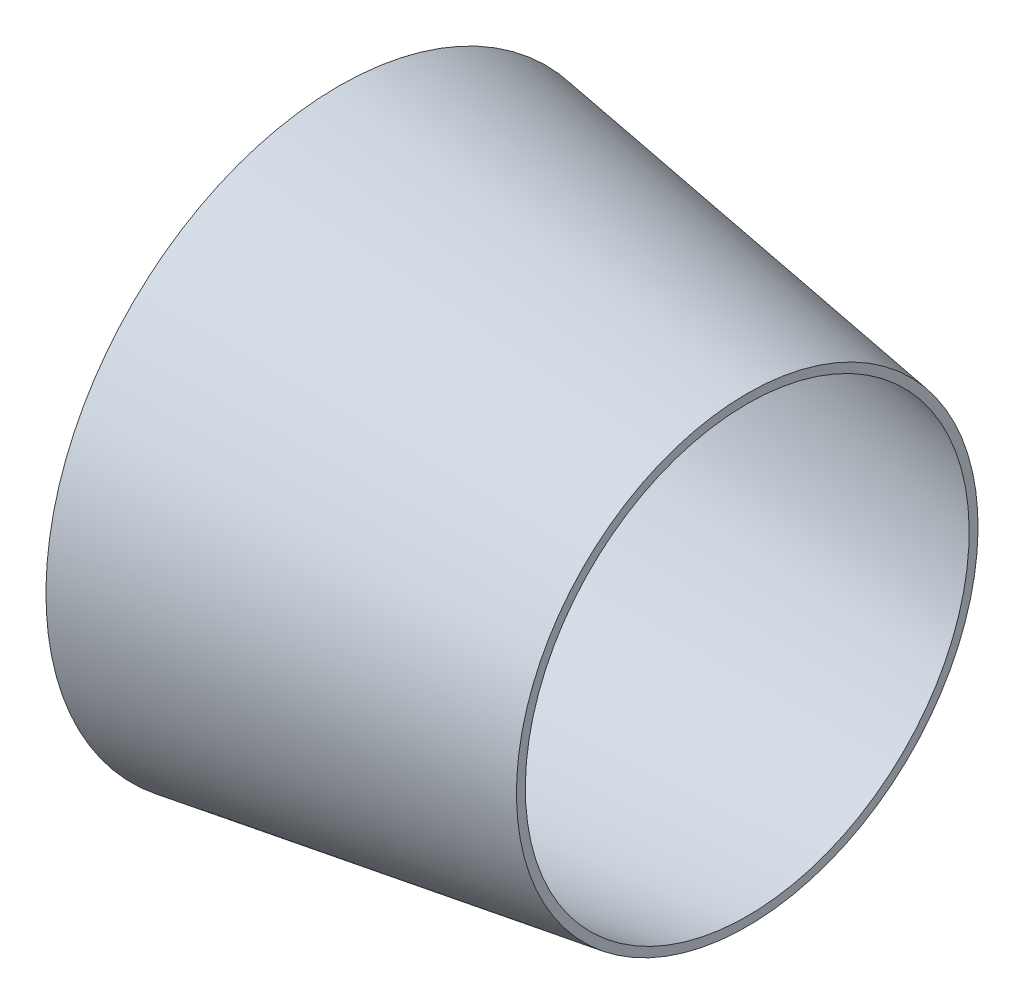
ISO-10303-21;
HEADER;
FILE_DESCRIPTION(('STEP AP214'),'2;1');
FILE_NAME('part.step','',(''),(''),'','','');
FILE_SCHEMA(('AUTOMOTIVE_DESIGN { 1 0 10303 214 1 1 1 1 }'));
ENDSEC;
DATA;
#1=APPLICATION_CONTEXT('core data for automotive mechanical design processes');
#2=APPLICATION_PROTOCOL_DEFINITION('international standard','automotive_design',2000,#1);
#3=PRODUCT_CONTEXT('',#1,'mechanical');
#4=PRODUCT('Part','Part','',(#3));
#5=PRODUCT_RELATED_PRODUCT_CATEGORY('part','',(#4));
#6=PRODUCT_DEFINITION_FORMATION('','',#4);
#7=PRODUCT_DEFINITION_CONTEXT('part definition',#1,'design');
#8=PRODUCT_DEFINITION('design','',#6,#7);
#9=PRODUCT_DEFINITION_SHAPE('','',#8);
#10=(LENGTH_UNIT() NAMED_UNIT(*) SI_UNIT(.MILLI.,.METRE.));
#11=(NAMED_UNIT(*) PLANE_ANGLE_UNIT() SI_UNIT($,.RADIAN.));
#12=(NAMED_UNIT(*) SI_UNIT($,.STERADIAN.) SOLID_ANGLE_UNIT());
#13=UNCERTAINTY_MEASURE_WITH_UNIT(LENGTH_MEASURE(1.E-05),#10,'distance_accuracy_value','');
#14=(GEOMETRIC_REPRESENTATION_CONTEXT(3) GLOBAL_UNCERTAINTY_ASSIGNED_CONTEXT((#13)) GLOBAL_UNIT_ASSIGNED_CONTEXT((#10,
#11,#12)) REPRESENTATION_CONTEXT('',''));
#15=CARTESIAN_POINT('',(0.,0.,0.));
#16=DIRECTION('',(0.,0.,1.));
#17=DIRECTION('',(1.,0.,0.));
#18=AXIS2_PLACEMENT_3D('',#15,#16,#17);
#19=CARTESIAN_POINT('',(3200.,0.,0.));
#20=DIRECTION('',(-1.,0.,0.));
#21=DIRECTION('',(0.,0.,1.));
#22=AXIS2_PLACEMENT_3D('',#19,#20,#21);
#23=CONICAL_SURFACE('',#22,1550.,0.129702537155912);
#24=CARTESIAN_POINT('',(3200.,0.,0.));
#25=DIRECTION('',(-1.,0.,0.));
#26=DIRECTION('',(0.,0.,1.));
#27=AXIS2_PLACEMENT_3D('',#24,#25,#26);
#28=CIRCLE('',#27,1550.);
#29=CARTESIAN_POINT('',(3200.,1550.,-1.1128358392509E-05));
#30=VERTEX_POINT('',#29);
#31=CARTESIAN_POINT('',(3200.,1550.,0.));
#32=VERTEX_POINT('',#31);
#33=EDGE_CURVE('E11',#30,#32,#28,.T.);
#34=ORIENTED_EDGE('',*,*,#33,.T.);
#35=DIRECTION('',(0.991600411186222,-0.129339184067768,0.));
#36=VECTOR('',#35,1.);
#37=CARTESIAN_POINT('',(5500.,1250.,0.));
#38=LINE('',#37,#36);
#39=CARTESIAN_POINT('',(5500.,1250.,0.));
#40=VERTEX_POINT('',#39);
#41=EDGE_CURVE('E100',#32,#40,#38,.T.);
#42=ORIENTED_EDGE('',*,*,#41,.T.);
#43=CARTESIAN_POINT('',(5500.,0.,0.));
#44=DIRECTION('',(-1.,0.,0.));
#45=DIRECTION('',(0.,0.,1.));
#46=AXIS2_PLACEMENT_3D('',#43,#44,#45);
#47=CIRCLE('',#46,1250.);
#48=CARTESIAN_POINT('',(5500.,1250.,-8.97448257460403E-06));
#49=VERTEX_POINT('',#48);
#50=EDGE_CURVE('E80',#49,#40,#47,.T.);
#51=ORIENTED_EDGE('',*,*,#50,.F.);
#52=DIRECTION('',(0.991600411186222,-0.129339184067768,9.2860180290375E-10));
#53=VECTOR('',#52,1.);
#54=CARTESIAN_POINT('',(5500.,1250.,-8.97448257460403E-06));
#55=LINE('',#54,#53);
#56=EDGE_CURVE('E103',#30,#49,#55,.T.);
#57=ORIENTED_EDGE('',*,*,#56,.F.);
#58=EDGE_LOOP('',(#34,#42,#51,#57));
#59=FACE_BOUND('',#58,.T.);
#60=ADVANCED_FACE('F39',(#59),#23,.F.);
#61=CARTESIAN_POINT('',(3200.,1550.,-1.1128358392509E-05));
#62=DIRECTION('',(1.,0.,0.));
#63=DIRECTION('',(0.,0.,-1.));
#64=AXIS2_PLACEMENT_3D('',#61,#62,#63);
#65=PLANE('',#64);
#66=CARTESIAN_POINT('',(3200.,0.,0.));
#67=DIRECTION('',(-1.,0.,0.));
#68=DIRECTION('',(0.,0.,1.));
#69=AXIS2_PLACEMENT_3D('',#66,#67,#68);
#70=CIRCLE('',#69,1650.);
#71=CARTESIAN_POINT('',(3200.,1650.,-1.18463169984773E-05));
#72=VERTEX_POINT('',#71);
#73=CARTESIAN_POINT('',(3200.,1650.,0.));
#74=VERTEX_POINT('',#73);
#75=EDGE_CURVE('E50',#72,#74,#70,.T.);
#76=ORIENTED_EDGE('',*,*,#75,.T.);
#77=DIRECTION('',(0.,-1.,0.));
#78=VECTOR('',#77,1.);
#79=CARTESIAN_POINT('',(3200.,1550.,0.));
#80=LINE('',#79,#78);
#81=EDGE_CURVE('E104',#74,#32,#80,.T.);
#82=ORIENTED_EDGE('',*,*,#81,.T.);
#83=ORIENTED_EDGE('',*,*,#33,.F.);
#84=DIRECTION('',(0.,-1.,7.17958605968322E-09));
#85=VECTOR('',#84,1.);
#86=CARTESIAN_POINT('',(3200.,1550.,-1.1128358392509E-05));
#87=LINE('',#86,#85);
#88=EDGE_CURVE('E91',#72,#30,#87,.T.);
#89=ORIENTED_EDGE('',*,*,#88,.F.);
#90=EDGE_LOOP('',(#76,#82,#83,#89));
#91=FACE_BOUND('',#90,.T.);
#92=ADVANCED_FACE('F41',(#91),#65,.F.);
#93=CARTESIAN_POINT('',(5500.,0.,0.));
#94=DIRECTION('',(-1.,0.,0.));
#95=DIRECTION('',(0.,0.,1.));
#96=AXIS2_PLACEMENT_3D('',#93,#94,#95);
#97=CONICAL_SURFACE('',#96,1300.,0.151015342921359);
#98=CARTESIAN_POINT('',(5500.,0.,0.));
#99=DIRECTION('',(-1.,0.,0.));
#100=DIRECTION('',(0.,0.,1.));
#101=AXIS2_PLACEMENT_3D('',#98,#99,#100);
#102=CIRCLE('',#101,1300.);
#103=CARTESIAN_POINT('',(5500.,1300.,-9.33346187758819E-06));
#104=VERTEX_POINT('',#103);
#105=CARTESIAN_POINT('',(5500.,1300.,0.));
#106=VERTEX_POINT('',#105);
#107=EDGE_CURVE('E89',#104,#106,#102,.T.);
#108=ORIENTED_EDGE('',*,*,#107,.T.);
#109=DIRECTION('',(-0.988618837339612,0.150441996986463,0.));
#110=VECTOR('',#109,1.);
#111=CARTESIAN_POINT('',(3200.,1650.,0.));
#112=LINE('',#111,#110);
#113=EDGE_CURVE('E97',#106,#74,#112,.T.);
#114=ORIENTED_EDGE('',*,*,#113,.T.);
#115=ORIENTED_EDGE('',*,*,#75,.F.);
#116=DIRECTION('',(-0.988618837339612,0.150441996986463,-1.08011126435491E-09));
#117=VECTOR('',#116,1.);
#118=CARTESIAN_POINT('',(3200.,1650.,-1.18463169984773E-05));
#119=LINE('',#118,#117);
#120=EDGE_CURVE('E109',#104,#72,#119,.T.);
#121=ORIENTED_EDGE('',*,*,#120,.F.);
#122=EDGE_LOOP('',(#108,#114,#115,#121));
#123=FACE_BOUND('',#122,.T.);
#124=ADVANCED_FACE('F112',(#123),#97,.T.);
#125=CARTESIAN_POINT('',(5500.,1300.,-9.33346187758819E-06));
#126=DIRECTION('',(-1.,0.,0.));
#127=DIRECTION('',(0.,0.,1.));
#128=AXIS2_PLACEMENT_3D('',#125,#126,#127);
#129=PLANE('',#128);
#130=DIRECTION('',(0.,1.,-7.17958605968322E-09));
#131=VECTOR('',#130,1.);
#132=CARTESIAN_POINT('',(5500.,1300.,-9.33346187758819E-06));
#133=LINE('',#132,#131);
#134=EDGE_CURVE('E82',#49,#104,#133,.T.);
#135=ORIENTED_EDGE('',*,*,#134,.F.);
#136=ORIENTED_EDGE('',*,*,#50,.T.);
#137=DIRECTION('',(0.,1.,0.));
#138=VECTOR('',#137,1.);
#139=CARTESIAN_POINT('',(5500.,1300.,0.));
#140=LINE('',#139,#138);
#141=EDGE_CURVE('E85',#40,#106,#140,.T.);
#142=ORIENTED_EDGE('',*,*,#141,.T.);
#143=ORIENTED_EDGE('',*,*,#107,.F.);
#144=EDGE_LOOP('',(#135,#136,#142,#143));
#145=FACE_BOUND('',#144,.T.);
#146=ADVANCED_FACE('F83',(#145),#129,.F.);
#147=CARTESIAN_POINT('',(0.,0.,0.));
#148=DIRECTION('',(0.,-7.17958605968322E-09,-1.));
#149=DIRECTION('',(-1.,0.,0.));
#150=AXIS2_PLACEMENT_3D('',#147,#148,#149);
#151=PLANE('',#150);
#152=ORIENTED_EDGE('',*,*,#56,.T.);
#153=ORIENTED_EDGE('',*,*,#134,.T.);
#154=ORIENTED_EDGE('',*,*,#120,.T.);
#155=ORIENTED_EDGE('',*,*,#88,.T.);
#156=EDGE_LOOP('',(#152,#153,#154,#155));
#157=FACE_BOUND('',#156,.T.);
#158=ADVANCED_FACE('F111',(#157),#151,.F.);
#159=CARTESIAN_POINT('',(0.,0.,0.));
#160=DIRECTION('',(0.,0.,-1.));
#161=DIRECTION('',(-1.,0.,0.));
#162=AXIS2_PLACEMENT_3D('',#159,#160,#161);
#163=PLANE('',#162);
#164=ORIENTED_EDGE('',*,*,#41,.F.);
#165=ORIENTED_EDGE('',*,*,#81,.F.);
#166=ORIENTED_EDGE('',*,*,#113,.F.);
#167=ORIENTED_EDGE('',*,*,#141,.F.);
#168=EDGE_LOOP('',(#164,#165,#166,#167));
#169=FACE_BOUND('',#168,.T.);
#170=ADVANCED_FACE('F94',(#169),#163,.T.);
#171=CLOSED_SHELL('',(#60,#92,#124,#146,#158,#170));
#172=MANIFOLD_SOLID_BREP('B2',#171);
#173=ADVANCED_BREP_SHAPE_REPRESENTATION('',(#18,#172),#14);
#174=SHAPE_DEFINITION_REPRESENTATION(#9,#173);
ENDSEC;
END-ISO-10303-21;
